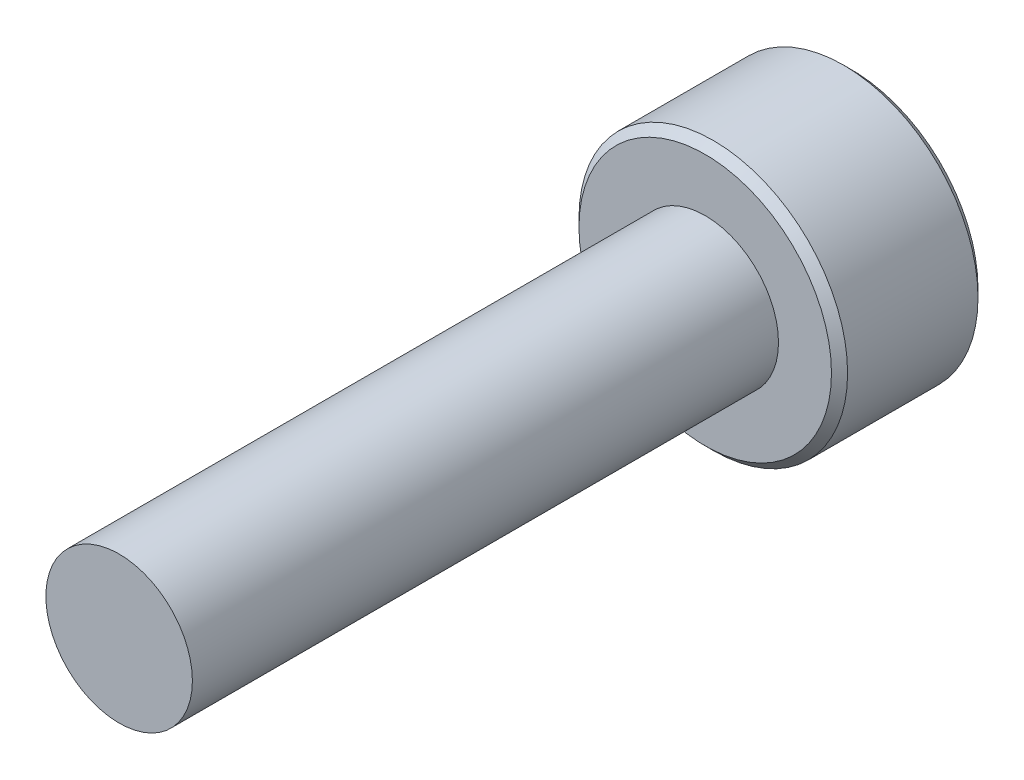
ISO-10303-21;
HEADER;
FILE_DESCRIPTION(('STEP AP214'),'2;1');
FILE_NAME('part.step','',(''),(''),'','','');
FILE_SCHEMA(('AUTOMOTIVE_DESIGN { 1 0 10303 214 1 1 1 1 }'));
ENDSEC;
DATA;
#1=APPLICATION_CONTEXT('core data for automotive mechanical design processes');
#2=APPLICATION_PROTOCOL_DEFINITION('international standard','automotive_design',2000,#1);
#3=PRODUCT_CONTEXT('',#1,'mechanical');
#4=PRODUCT('Part','Part','',(#3));
#5=PRODUCT_RELATED_PRODUCT_CATEGORY('part','',(#4));
#6=PRODUCT_DEFINITION_FORMATION('','',#4);
#7=PRODUCT_DEFINITION_CONTEXT('part definition',#1,'design');
#8=PRODUCT_DEFINITION('design','',#6,#7);
#9=PRODUCT_DEFINITION_SHAPE('','',#8);
#10=(LENGTH_UNIT() NAMED_UNIT(*) SI_UNIT(.MILLI.,.METRE.));
#11=(NAMED_UNIT(*) PLANE_ANGLE_UNIT() SI_UNIT($,.RADIAN.));
#12=(NAMED_UNIT(*) SI_UNIT($,.STERADIAN.) SOLID_ANGLE_UNIT());
#13=UNCERTAINTY_MEASURE_WITH_UNIT(LENGTH_MEASURE(1.E-05),#10,'distance_accuracy_value','');
#14=(GEOMETRIC_REPRESENTATION_CONTEXT(3) GLOBAL_UNCERTAINTY_ASSIGNED_CONTEXT((#13)) GLOBAL_UNIT_ASSIGNED_CONTEXT((#10,
#11,#12)) REPRESENTATION_CONTEXT('',''));
#15=CARTESIAN_POINT('',(0.,0.,0.));
#16=DIRECTION('',(0.,0.,1.));
#17=DIRECTION('',(1.,0.,0.));
#18=AXIS2_PLACEMENT_3D('',#15,#16,#17);
#19=CARTESIAN_POINT('',(0.,0.,-12.));
#20=DIRECTION('',(0.,0.,1.));
#21=DIRECTION('',(1.,0.,0.));
#22=AXIS2_PLACEMENT_3D('',#19,#20,#21);
#23=CYLINDRICAL_SURFACE('',#22,1.5);
#24=CARTESIAN_POINT('',(0.,0.,0.));
#25=DIRECTION('',(0.,0.,1.));
#26=DIRECTION('',(1.,0.,0.));
#27=AXIS2_PLACEMENT_3D('',#24,#25,#26);
#28=CIRCLE('',#27,1.5);
#29=CARTESIAN_POINT('',(1.5,0.,0.));
#30=VERTEX_POINT('',#29);
#31=EDGE_CURVE('E128',#30,#30,#28,.T.);
#32=ORIENTED_EDGE('',*,*,#31,.F.);
#33=EDGE_LOOP('',(#32));
#34=FACE_BOUND('',#33,.T.);
#35=CARTESIAN_POINT('',(0.,0.,-12.));
#36=DIRECTION('',(0.,0.,-1.));
#37=DIRECTION('',(-1.,0.,0.));
#38=AXIS2_PLACEMENT_3D('',#35,#36,#37);
#39=CIRCLE('',#38,1.5);
#40=CARTESIAN_POINT('',(-1.5,0.,-12.));
#41=VERTEX_POINT('',#40);
#42=EDGE_CURVE('E237',#41,#41,#39,.F.);
#43=ORIENTED_EDGE('',*,*,#42,.T.);
#44=EDGE_LOOP('',(#43));
#45=FACE_BOUND('',#44,.T.);
#46=ADVANCED_FACE('F41',(#34,#45),#23,.T.);
#47=CARTESIAN_POINT('',(0.,0.,0.));
#48=DIRECTION('',(0.,0.,1.));
#49=DIRECTION('',(1.,0.,0.));
#50=AXIS2_PLACEMENT_3D('',#47,#48,#49);
#51=PLANE('',#50);
#52=ORIENTED_EDGE('',*,*,#31,.T.);
#53=EDGE_LOOP('',(#52));
#54=FACE_BOUND('',#53,.T.);
#55=ADVANCED_FACE('F222',(#54),#51,.T.);
#56=CARTESIAN_POINT('',(0.,0.,-15.));
#57=DIRECTION('',(0.,0.,1.));
#58=DIRECTION('',(1.,0.,0.));
#59=AXIS2_PLACEMENT_3D('',#56,#57,#58);
#60=CYLINDRICAL_SURFACE('',#59,2.75);
#61=CARTESIAN_POINT('',(0.,0.,-14.835));
#62=DIRECTION('',(0.,0.,-1.));
#63=DIRECTION('',(-1.,0.,0.));
#64=AXIS2_PLACEMENT_3D('',#61,#62,#63);
#65=CIRCLE('',#64,2.75);
#66=CARTESIAN_POINT('',(-2.75,0.,-14.835));
#67=VERTEX_POINT('',#66);
#68=EDGE_CURVE('E50',#67,#67,#65,.F.);
#69=ORIENTED_EDGE('',*,*,#68,.T.);
#70=EDGE_LOOP('',(#69));
#71=FACE_BOUND('',#70,.T.);
#72=CARTESIAN_POINT('',(0.,0.,-12.165));
#73=DIRECTION('',(0.,0.,-1.));
#74=DIRECTION('',(-1.,0.,0.));
#75=AXIS2_PLACEMENT_3D('',#72,#73,#74);
#76=CIRCLE('',#75,2.75);
#77=CARTESIAN_POINT('',(-2.75,0.,-12.165));
#78=VERTEX_POINT('',#77);
#79=EDGE_CURVE('E198',#78,#78,#76,.T.);
#80=ORIENTED_EDGE('',*,*,#79,.T.);
#81=EDGE_LOOP('',(#80));
#82=FACE_BOUND('',#81,.T.);
#83=ADVANCED_FACE('F206',(#71,#82),#60,.T.);
#84=CARTESIAN_POINT('',(0.,0.,-15.));
#85=DIRECTION('',(0.,0.,-1.));
#86=DIRECTION('',(-1.,0.,0.));
#87=AXIS2_PLACEMENT_3D('',#84,#85,#86);
#88=PLANE('',#87);
#89=CARTESIAN_POINT('',(0.,0.,-15.));
#90=DIRECTION('',(0.,0.,-1.));
#91=DIRECTION('',(-1.,0.,0.));
#92=AXIS2_PLACEMENT_3D('',#89,#90,#91);
#93=CIRCLE('',#92,2.585);
#94=CARTESIAN_POINT('',(-2.585,0.,-15.));
#95=VERTEX_POINT('',#94);
#96=EDGE_CURVE('E127',#95,#95,#93,.T.);
#97=ORIENTED_EDGE('',*,*,#96,.T.);
#98=EDGE_LOOP('',(#97));
#99=FACE_BOUND('',#98,.T.);
#100=CARTESIAN_POINT('',(0.,0.,-15.));
#101=DIRECTION('',(0.,0.,-1.));
#102=DIRECTION('',(-1.,0.,0.));
#103=AXIS2_PLACEMENT_3D('',#100,#101,#102);
#104=CIRCLE('',#103,1.44337567297406);
#105=CARTESIAN_POINT('',(-1.25,0.721687836487034,-15.));
#106=VERTEX_POINT('',#105);
#107=CARTESIAN_POINT('',(0.,1.44337567297406,-15.));
#108=VERTEX_POINT('',#107);
#109=EDGE_CURVE('E106',#106,#108,#104,.T.);
#110=ORIENTED_EDGE('',*,*,#109,.F.);
#111=CARTESIAN_POINT('',(-1.25,-0.721687836487033,-15.));
#112=VERTEX_POINT('',#111);
#113=EDGE_CURVE('E58',#112,#106,#104,.T.);
#114=ORIENTED_EDGE('',*,*,#113,.F.);
#115=CARTESIAN_POINT('',(0.,-1.44337567297406,-15.));
#116=VERTEX_POINT('',#115);
#117=EDGE_CURVE('E308',#116,#112,#104,.T.);
#118=ORIENTED_EDGE('',*,*,#117,.F.);
#119=CARTESIAN_POINT('',(1.25,-0.721687836487034,-15.));
#120=VERTEX_POINT('',#119);
#121=EDGE_CURVE('E68',#120,#116,#104,.T.);
#122=ORIENTED_EDGE('',*,*,#121,.F.);
#123=CARTESIAN_POINT('',(1.25,0.721687836487033,-15.));
#124=VERTEX_POINT('',#123);
#125=EDGE_CURVE('E151',#124,#120,#104,.T.);
#126=ORIENTED_EDGE('',*,*,#125,.F.);
#127=EDGE_CURVE('E116',#108,#124,#104,.T.);
#128=ORIENTED_EDGE('',*,*,#127,.F.);
#129=EDGE_LOOP('',(#110,#114,#118,#122,#126,#128));
#130=FACE_BOUND('',#129,.T.);
#131=ADVANCED_FACE('F150',(#99,#130),#88,.T.);
#132=CARTESIAN_POINT('',(0.,0.,-12.));
#133=DIRECTION('',(0.,0.,-1.));
#134=DIRECTION('',(-1.,0.,0.));
#135=AXIS2_PLACEMENT_3D('',#132,#133,#134);
#136=PLANE('',#135);
#137=CARTESIAN_POINT('',(0.,0.,-12.));
#138=DIRECTION('',(0.,0.,-1.));
#139=DIRECTION('',(-1.,0.,0.));
#140=AXIS2_PLACEMENT_3D('',#137,#138,#139);
#141=CIRCLE('',#140,2.585);
#142=CARTESIAN_POINT('',(-2.585,0.,-12.));
#143=VERTEX_POINT('',#142);
#144=EDGE_CURVE('E11',#143,#143,#141,.F.);
#145=ORIENTED_EDGE('',*,*,#144,.T.);
#146=EDGE_LOOP('',(#145));
#147=FACE_BOUND('',#146,.T.);
#148=ORIENTED_EDGE('',*,*,#42,.F.);
#149=EDGE_LOOP('',(#148));
#150=FACE_BOUND('',#149,.T.);
#151=ADVANCED_FACE('F215',(#147,#150),#136,.F.);
#152=CARTESIAN_POINT('',(0.,0.,-15.));
#153=DIRECTION('',(0.,0.,-1.));
#154=DIRECTION('',(-1.,0.,0.));
#155=AXIS2_PLACEMENT_3D('',#152,#153,#154);
#156=CONICAL_SURFACE('',#155,1.44337567297406,0.78539816339745);
#157=ORIENTED_EDGE('',*,*,#127,.T.);
#158=CARTESIAN_POINT('',(-0.000199999999999753,1.4434911430279,-15.0001154839091));
#159=CARTESIAN_POINT('',(0.042775167071587,1.41867941875065,-14.9753216680551));
#160=CARTESIAN_POINT('',(0.0864690047459486,1.39345276980743,-14.9519837344187));
#161=CARTESIAN_POINT('',(0.175565930841943,1.34201263554194,-14.9092520040845));
#162=CARTESIAN_POINT('',(0.220977498357065,1.31579425481276,-14.8898819923604));
#163=CARTESIAN_POINT('',(0.312547820935261,1.26292610442246,-14.8567004834135));
#164=CARTESIAN_POINT('',(0.358683240175886,1.23628980770471,-14.8428055590527));
#165=CARTESIAN_POINT('',(0.451970080407593,1.18243062538508,-14.8213972821606));
#166=CARTESIAN_POINT('',(0.499118649136381,1.15520938653761,-14.8138679415668));
#167=CARTESIAN_POINT('',(0.580373556887254,1.10829684367467,-14.8070744980507));
#168=CARTESIAN_POINT('',(0.614374876627942,1.08866617256958,-14.8060685591043));
#169=CARTESIAN_POINT('',(0.682317764432479,1.04943932800611,-14.8077614149113));
#170=CARTESIAN_POINT('',(0.716259317655659,1.02984316311599,-14.8104610272155));
#171=CARTESIAN_POINT('',(0.783814856457501,0.990839954603499,-14.8194089303164));
#172=CARTESIAN_POINT('',(0.817428507286776,0.971433104248771,-14.8256605258997));
#173=CARTESIAN_POINT('',(0.884094638217814,0.932943395609905,-14.8413756814139));
#174=CARTESIAN_POINT('',(0.917146871030297,0.9138606800983,-14.8508406200875));
#175=CARTESIAN_POINT('',(1.00179969160027,0.864986351354567,-14.8789313906876));
#176=CARTESIAN_POINT('',(1.05286649242964,0.835502920149076,-14.8996701574522));
#177=CARTESIAN_POINT('',(1.15300085411325,0.777690319475909,-14.9463871346715));
#178=CARTESIAN_POINT('',(1.20207431157827,0.749357745598417,-14.9723482959468));
#179=CARTESIAN_POINT('',(1.2502,0.721572366433195,-15.0001154839091));
#180=B_SPLINE_CURVE_WITH_KNOTS('',3,(#158,#159,#160,#161,#162,#163,#164,#165,#166,#167,#168,
#169,#170,#171,#172,#173,#174,#175,#176,#177,#178,#179),.UNSPECIFIED.,.F.,.F.,(4,2,2,2,2,2,2,2,
2,2,4),(0.,0.166533409618304,0.334037607289762,0.498880396489699,0.663307919240275,
0.780963963458828,0.898645970148454,1.01643764860773,1.1342799317155,1.32148652032141,
1.50809158792573),.UNSPECIFIED.);
#181=EDGE_CURVE('E121',#108,#124,#180,.T.);
#182=ORIENTED_EDGE('',*,*,#181,.F.);
#183=EDGE_LOOP('',(#157,#182));
#184=FACE_BOUND('',#183,.T.);
#185=ADVANCED_FACE('F122',(#184),#156,.F.);
#186=ORIENTED_EDGE('',*,*,#125,.T.);
#187=CARTESIAN_POINT('',(1.25,-1.43934010808077,-15.4629820968923));
#188=CARTESIAN_POINT('',(1.25,-1.40429313005659,-15.4365249226329));
#189=CARTESIAN_POINT('',(1.25,-1.36905087135599,-15.4103271603543));
#190=CARTESIAN_POINT('',(1.25,-1.29809650706311,-15.3585575718396));
#191=CARTESIAN_POINT('',(1.25,-1.26238428576495,-15.3329859043563));
#192=CARTESIAN_POINT('',(1.25,-1.15390111792708,-15.2570059936895));
#193=CARTESIAN_POINT('',(1.25,-1.08031646726264,-15.2077402861896));
#194=CARTESIAN_POINT('',(1.25,-0.926012322755096,-15.1110258302631));
#195=CARTESIAN_POINT('',(1.25,-0.845125318656147,-15.0638412989418));
#196=CARTESIAN_POINT('',(1.25,-0.679311174076603,-14.9775307343904));
#197=CARTESIAN_POINT('',(1.25,-0.594398891026688,-14.9383775346269));
#198=CARTESIAN_POINT('',(1.25,-0.466944812460741,-14.8904772236883));
#199=CARTESIAN_POINT('',(1.25,-0.426289985812822,-14.8767294897863));
#200=CARTESIAN_POINT('',(1.25,-0.343998850091268,-14.8524979274505));
#201=CARTESIAN_POINT('',(1.25,-0.302362473614963,-14.8420143238698));
#202=CARTESIAN_POINT('',(1.25,-0.219052696285666,-14.8250301617483));
#203=CARTESIAN_POINT('',(1.25,-0.1773934284745,-14.8184613604714));
#204=CARTESIAN_POINT('',(1.25,-0.0936293693401927,-14.8094350534578));
#205=CARTESIAN_POINT('',(1.25,-0.0515246558543965,-14.8069768409973));
#206=CARTESIAN_POINT('',(1.25,0.0311890576306312,-14.8063540620133));
#207=CARTESIAN_POINT('',(1.25,0.07179696254993,-14.8080371168462));
#208=CARTESIAN_POINT('',(1.25,0.152668636885197,-14.8152682705979));
#209=CARTESIAN_POINT('',(1.25,0.192932338835358,-14.8208171104131));
#210=CARTESIAN_POINT('',(1.25,0.273499879165295,-14.835571036465));
#211=CARTESIAN_POINT('',(1.25,0.313792180618511,-14.8448381759641));
#212=CARTESIAN_POINT('',(1.25,0.393496413911457,-14.8665361784573));
#213=CARTESIAN_POINT('',(1.25,0.432908419115059,-14.8789667767306));
#214=CARTESIAN_POINT('',(1.25,0.556992735862298,-14.9227793529314));
#215=CARTESIAN_POINT('',(1.25,0.639898924666084,-14.959151072876));
#216=CARTESIAN_POINT('',(1.25,0.8018165554997,-15.0400191621783));
#217=CARTESIAN_POINT('',(1.25,0.880812666325043,-15.084544720912));
#218=CARTESIAN_POINT('',(1.25,1.0317856127975,-15.1764048766666));
#219=CARTESIAN_POINT('',(1.25,1.10391618485086,-15.2234899339162));
#220=CARTESIAN_POINT('',(1.25,1.2101860604331,-15.2962785615985));
#221=CARTESIAN_POINT('',(1.25,1.24515069969379,-15.3207980853934));
#222=CARTESIAN_POINT('',(1.25,1.31460220852736,-15.3704856367657));
#223=CARTESIAN_POINT('',(1.25,1.34908920596618,-15.3956534854155));
#224=CARTESIAN_POINT('',(1.25,1.38337731682911,-15.4210901488412));
#225=B_SPLINE_CURVE_WITH_KNOTS('',3,(#187,#188,#189,#190,#191,#192,#193,#194,#195,#196,#197,
#198,#199,#200,#201,#202,#203,#204,#205,#206,#207,#208,#209,#210,#211,#212,#213,#214,#215,#216,
#217,#218,#219,#220,#221,#222,#223,#224),.UNSPECIFIED.,.F.,.F.,(4,2,2,2,2,2,2,2,2,2,2,2,2,2,2,2,
2,2,4),(0.,0.131732960381448,0.263498984161645,0.529042014455826,0.809741926134619,
1.08947609717225,1.21811634272577,1.346765447839,1.47310084517844,1.59941451973785,
1.72115042167849,1.84290966131735,1.96679153905342,2.09066305366039,2.36146692896009,
2.63325989198491,2.89154668212279,3.01965734507713,3.14773302245628),.UNSPECIFIED.);
#226=EDGE_CURVE('E115',#124,#120,#225,.F.);
#227=ORIENTED_EDGE('',*,*,#226,.F.);
#228=EDGE_LOOP('',(#186,#227));
#229=FACE_BOUND('',#228,.T.);
#230=ADVANCED_FACE('F317',(#229),#156,.F.);
#231=ORIENTED_EDGE('',*,*,#121,.T.);
#232=CARTESIAN_POINT('',(1.2502,-0.721572366433195,-15.0001154839091));
#233=CARTESIAN_POINT('',(1.20722483292841,-0.746384090710445,-14.9753216680551));
#234=CARTESIAN_POINT('',(1.16353099525405,-0.771610739653665,-14.9519837344187));
#235=CARTESIAN_POINT('',(1.07443406915806,-0.823050873919156,-14.9092520040845));
#236=CARTESIAN_POINT('',(1.02902250164293,-0.849269254648334,-14.8898819923604));
#237=CARTESIAN_POINT('',(0.937452179064739,-0.902137405038636,-14.8567004834135));
#238=CARTESIAN_POINT('',(0.891316759824113,-0.928773701756388,-14.8428055590527));
#239=CARTESIAN_POINT('',(0.798029919592406,-0.982632884076013,-14.8213972821606));
#240=CARTESIAN_POINT('',(0.750881350863619,-1.00985412292348,-14.8138679415668));
#241=CARTESIAN_POINT('',(0.669626443112746,-1.05676666578643,-14.8070744980507));
#242=CARTESIAN_POINT('',(0.635625123372057,-1.07639733689152,-14.8060685591043));
#243=CARTESIAN_POINT('',(0.567682235567521,-1.11562418145499,-14.8077614149113));
#244=CARTESIAN_POINT('',(0.533740682344341,-1.1352203463451,-14.8104610272155));
#245=CARTESIAN_POINT('',(0.466185143542499,-1.1742235548576,-14.8194089303164));
#246=CARTESIAN_POINT('',(0.432571492713224,-1.19363040521233,-14.8256605258997));
#247=CARTESIAN_POINT('',(0.365905361782185,-1.23212011385119,-14.8413756814139));
#248=CARTESIAN_POINT('',(0.332853128969703,-1.2512028293628,-14.8508406200875));
#249=CARTESIAN_POINT('',(0.248200308399734,-1.30007715810653,-14.8789313906876));
#250=CARTESIAN_POINT('',(0.197133507570361,-1.32956058931202,-14.8996701574522));
#251=CARTESIAN_POINT('',(0.0969991458867449,-1.38737318998519,-14.9463871346715));
#252=CARTESIAN_POINT('',(0.0479256884217306,-1.41570576386268,-14.9723482959468));
#253=CARTESIAN_POINT('',(-0.000200000000000048,-1.4434911430279,-15.0001154839091));
#254=B_SPLINE_CURVE_WITH_KNOTS('',3,(#232,#233,#234,#235,#236,#237,#238,#239,#240,#241,#242,
#243,#244,#245,#246,#247,#248,#249,#250,#251,#252,#253),.UNSPECIFIED.,.F.,.F.,(4,2,2,2,2,2,2,2,
2,2,4),(0.,0.166533409618305,0.334037607289762,0.498880396489699,0.663307919240275,
0.780963963458827,0.898645970148454,1.01643764860773,1.1342799317155,1.32148652032141,
1.50809158792573),.UNSPECIFIED.);
#255=EDGE_CURVE('E165',#120,#116,#254,.T.);
#256=ORIENTED_EDGE('',*,*,#255,.F.);
#257=EDGE_LOOP('',(#231,#256));
#258=FACE_BOUND('',#257,.T.);
#259=ADVANCED_FACE('F314',(#258),#156,.F.);
#260=ORIENTED_EDGE('',*,*,#117,.T.);
#261=CARTESIAN_POINT('',(0.000199999999999485,-1.4434911430279,-15.0001154839091));
#262=CARTESIAN_POINT('',(-0.0427751670715873,-1.41867941875065,-14.9753216680551));
#263=CARTESIAN_POINT('',(-0.0864690047459488,-1.39345276980743,-14.9519837344187));
#264=CARTESIAN_POINT('',(-0.175565930841943,-1.34201263554194,-14.9092520040845));
#265=CARTESIAN_POINT('',(-0.220977498357065,-1.31579425481276,-14.8898819923604));
#266=CARTESIAN_POINT('',(-0.31254782093526,-1.26292610442246,-14.8567004834135));
#267=CARTESIAN_POINT('',(-0.358683240175886,-1.23628980770471,-14.8428055590527));
#268=CARTESIAN_POINT('',(-0.451970080407593,-1.18243062538508,-14.8213972821606));
#269=CARTESIAN_POINT('',(-0.49911864913638,-1.15520938653761,-14.8138679415668));
#270=CARTESIAN_POINT('',(-0.580373556887252,-1.10829684367467,-14.8070744980507));
#271=CARTESIAN_POINT('',(-0.614374876627941,-1.08866617256958,-14.8060685591043));
#272=CARTESIAN_POINT('',(-0.682317764432477,-1.04943932800611,-14.8077614149113));
#273=CARTESIAN_POINT('',(-0.716259317655657,-1.02984316311599,-14.8104610272155));
#274=CARTESIAN_POINT('',(-0.783814856457499,-0.9908399546035,-14.8194089303164));
#275=CARTESIAN_POINT('',(-0.817428507286775,-0.971433104248772,-14.8256605258997));
#276=CARTESIAN_POINT('',(-0.884094638217813,-0.932943395609906,-14.8413756814139));
#277=CARTESIAN_POINT('',(-0.917146871030296,-0.913860680098301,-14.8508406200875));
#278=CARTESIAN_POINT('',(-1.00179969160026,-0.864986351354568,-14.8789313906876));
#279=CARTESIAN_POINT('',(-1.05286649242964,-0.835502920149077,-14.8996701574522));
#280=CARTESIAN_POINT('',(-1.15300085411325,-0.777690319475909,-14.9463871346715));
#281=CARTESIAN_POINT('',(-1.20207431157827,-0.749357745598418,-14.9723482959468));
#282=CARTESIAN_POINT('',(-1.2502,-0.721572366433195,-15.0001154839091));
#283=B_SPLINE_CURVE_WITH_KNOTS('',3,(#261,#262,#263,#264,#265,#266,#267,#268,#269,#270,#271,
#272,#273,#274,#275,#276,#277,#278,#279,#280,#281,#282),.UNSPECIFIED.,.F.,.F.,(4,2,2,2,2,2,2,2,
2,2,4),(0.,0.166533409618304,0.334037607289762,0.498880396489698,0.663307919240274,
0.780963963458826,0.898645970148452,1.01643764860773,1.13427993171549,1.32148652032141,
1.50809158792573),.UNSPECIFIED.);
#284=EDGE_CURVE('E285',#116,#112,#283,.T.);
#285=ORIENTED_EDGE('',*,*,#284,.F.);
#286=EDGE_LOOP('',(#260,#285));
#287=FACE_BOUND('',#286,.T.);
#288=ADVANCED_FACE('F323',(#287),#156,.F.);
#289=ORIENTED_EDGE('',*,*,#113,.T.);
#290=CARTESIAN_POINT('',(-1.25,-1.43934010829019,-15.4629820970504));
#291=CARTESIAN_POINT('',(-1.25,-1.40429313026013,-15.4365249227849));
#292=CARTESIAN_POINT('',(-1.25,-1.36905087155364,-15.4103271605002));
#293=CARTESIAN_POINT('',(-1.25,-1.29809650724891,-15.3585575719734));
#294=CARTESIAN_POINT('',(-1.25,-1.2623842859448,-15.3329859044841));
#295=CARTESIAN_POINT('',(-1.25,-1.1539011180887,-15.257005993799));
#296=CARTESIAN_POINT('',(-1.25,-1.08031646741188,-15.207740286287));
#297=CARTESIAN_POINT('',(-1.25,-0.926012322877304,-15.1110258303356));
#298=CARTESIAN_POINT('',(-1.25,-0.84512531876365,-15.0638412990016));
#299=CARTESIAN_POINT('',(-1.25,-0.679311174153445,-14.9775307344266));
#300=CARTESIAN_POINT('',(-1.25,-0.594398891087584,-14.9383775346522));
#301=CARTESIAN_POINT('',(-1.25,-0.466944812509639,-14.8904772237056));
#302=CARTESIAN_POINT('',(-1.25,-0.426289985866745,-14.8767294898039));
#303=CARTESIAN_POINT('',(-1.25,-0.343998850155403,-14.8524979274677));
#304=CARTESIAN_POINT('',(-1.25,-0.302362473684286,-14.8420143238863));
#305=CARTESIAN_POINT('',(-1.25,-0.219052696365195,-14.8250301617622));
#306=CARTESIAN_POINT('',(-1.25,-0.177393428559044,-14.8184613604834));
#307=CARTESIAN_POINT('',(-1.25,-0.0936293694345982,-14.809435053465));
#308=CARTESIAN_POINT('',(-1.25,-0.0515246559536491,-14.8069768410015));
#309=CARTESIAN_POINT('',(-1.25,0.0311890575224384,-14.8063540620107));
#310=CARTESIAN_POINT('',(-1.25,0.0717969624376316,-14.8080371168399));
#311=CARTESIAN_POINT('',(-1.25,0.152668636765092,-14.8152682705835));
#312=CARTESIAN_POINT('',(-1.25,0.192932338711553,-14.8208171103943));
#313=CARTESIAN_POINT('',(-1.25,0.273499879034189,-14.835571036437));
#314=CARTESIAN_POINT('',(-1.25,0.313792180483814,-14.8448381759314));
#315=CARTESIAN_POINT('',(-1.25,0.393496413769925,-14.8665361784149));
#316=CARTESIAN_POINT('',(-1.25,0.432908418970283,-14.8789667766833));
#317=CARTESIAN_POINT('',(-1.25,0.556992735685997,-14.9227793528609));
#318=CARTESIAN_POINT('',(-1.25,0.639898924463084,-14.9591510727842));
#319=CARTESIAN_POINT('',(-1.25,0.801816555245349,-15.0400191620416));
#320=CARTESIAN_POINT('',(-1.25,0.880812666046053,-15.0845447207516));
#321=CARTESIAN_POINT('',(-1.25,1.03178561247421,-15.176404876461));
#322=CARTESIAN_POINT('',(-1.25,1.10391618450775,-15.2234899336892));
#323=CARTESIAN_POINT('',(-1.25,1.2101860600607,-15.2962785613395));
#324=CARTESIAN_POINT('',(-1.25,1.24515069931176,-15.3207980851238));
#325=CARTESIAN_POINT('',(-1.25,1.31460220812614,-15.3704856364749));
#326=CARTESIAN_POINT('',(-1.25,1.34908920555539,-15.3956534851142));
#327=CARTESIAN_POINT('',(-1.25,1.38337731640878,-15.4210901485293));
#328=B_SPLINE_CURVE_WITH_KNOTS('',3,(#290,#291,#292,#293,#294,#295,#296,#297,#298,#299,#300,
#301,#302,#303,#304,#305,#306,#307,#308,#309,#310,#311,#312,#313,#314,#315,#316,#317,#318,#319,
#320,#321,#322,#323,#324,#325,#326,#327),.UNSPECIFIED.,.F.,.F.,(4,2,2,2,2,2,2,2,2,2,2,2,2,2,2,2,
2,2,4),(0.,0.131732960406522,0.263498984211801,0.529042014557081,0.809741926293179,
1.08947609738757,1.21811634292656,1.3467654480253,1.47310084535082,1.59941451989631,
1.72115042182424,1.84290966145034,1.96679153917269,2.09066305376595,2.36146692896708,
2.63325989189267,2.89154668194565,3.01965734485811,3.1477330221954),.UNSPECIFIED.);
#329=EDGE_CURVE('E139',#112,#106,#328,.T.);
#330=ORIENTED_EDGE('',*,*,#329,.F.);
#331=EDGE_LOOP('',(#289,#330));
#332=FACE_BOUND('',#331,.T.);
#333=ADVANCED_FACE('F327',(#332),#156,.F.);
#334=ORIENTED_EDGE('',*,*,#109,.T.);
#335=CARTESIAN_POINT('',(-1.2502,0.721572366433195,-15.0001154839091));
#336=CARTESIAN_POINT('',(-1.20722483292841,0.746384090710445,-14.9753216680551));
#337=CARTESIAN_POINT('',(-1.16353099525405,0.771610739653666,-14.9519837344187));
#338=CARTESIAN_POINT('',(-1.07443406915806,0.823050873919156,-14.9092520040845));
#339=CARTESIAN_POINT('',(-1.02902250164293,0.849269254648335,-14.8898819923604));
#340=CARTESIAN_POINT('',(-0.937452179064738,0.902137405038637,-14.8567004834135));
#341=CARTESIAN_POINT('',(-0.891316759824113,0.928773701756388,-14.8428055590527));
#342=CARTESIAN_POINT('',(-0.798029919592406,0.982632884076014,-14.8213972821606));
#343=CARTESIAN_POINT('',(-0.750881350863619,1.00985412292348,-14.8138679415668));
#344=CARTESIAN_POINT('',(-0.669626443112746,1.05676666578643,-14.8070744980507));
#345=CARTESIAN_POINT('',(-0.635625123372058,1.07639733689152,-14.8060685591043));
#346=CARTESIAN_POINT('',(-0.567682235567521,1.11562418145499,-14.8077614149113));
#347=CARTESIAN_POINT('',(-0.533740682344341,1.1352203463451,-14.8104610272155));
#348=CARTESIAN_POINT('',(-0.466185143542499,1.1742235548576,-14.8194089303164));
#349=CARTESIAN_POINT('',(-0.432571492713224,1.19363040521233,-14.8256605258997));
#350=CARTESIAN_POINT('',(-0.365905361782186,1.23212011385119,-14.8413756814139));
#351=CARTESIAN_POINT('',(-0.332853128969703,1.2512028293628,-14.8508406200875));
#352=CARTESIAN_POINT('',(-0.248200308399735,1.30007715810653,-14.8789313906876));
#353=CARTESIAN_POINT('',(-0.197133507570361,1.32956058931202,-14.8996701574522));
#354=CARTESIAN_POINT('',(-0.0969991458867449,1.38737318998519,-14.9463871346715));
#355=CARTESIAN_POINT('',(-0.0479256884217303,1.41570576386268,-14.9723482959468));
#356=CARTESIAN_POINT('',(0.000199999999999714,1.4434911430279,-15.0001154839091));
#357=B_SPLINE_CURVE_WITH_KNOTS('',3,(#335,#336,#337,#338,#339,#340,#341,#342,#343,#344,#345,
#346,#347,#348,#349,#350,#351,#352,#353,#354,#355,#356),.UNSPECIFIED.,.F.,.F.,(4,2,2,2,2,2,2,2,
2,2,4),(0.,0.166533409618305,0.334037607289763,0.498880396489699,0.663307919240275,
0.780963963458827,0.898645970148453,1.01643764860773,1.1342799317155,1.32148652032141,
1.50809158792573),.UNSPECIFIED.);
#358=EDGE_CURVE('E110',#106,#108,#357,.T.);
#359=ORIENTED_EDGE('',*,*,#358,.F.);
#360=EDGE_LOOP('',(#334,#359));
#361=FACE_BOUND('',#360,.T.);
#362=ADVANCED_FACE('F108',(#361),#156,.F.);
#363=CARTESIAN_POINT('',(1.25,2.1650635094611,-13.125));
#364=DIRECTION('',(0.,0.,-1.));
#365=DIRECTION('',(-1.,0.,0.));
#366=AXIS2_PLACEMENT_3D('',#363,#364,#365);
#367=PLANE('',#366);
#368=DIRECTION('',(0.866025403784439,0.5,0.));
#369=VECTOR('',#368,1.);
#370=CARTESIAN_POINT('',(-1.25,0.721687836487033,-13.125));
#371=LINE('',#370,#369);
#372=CARTESIAN_POINT('',(-1.25,0.721687836487033,-13.125));
#373=VERTEX_POINT('',#372);
#374=CARTESIAN_POINT('',(0.,1.44337567297406,-13.125));
#375=VERTEX_POINT('',#374);
#376=EDGE_CURVE('E138',#373,#375,#371,.T.);
#377=ORIENTED_EDGE('',*,*,#376,.T.);
#378=DIRECTION('',(0.866025403784439,-0.5,0.));
#379=VECTOR('',#378,1.);
#380=CARTESIAN_POINT('',(0.,1.44337567297406,-13.125));
#381=LINE('',#380,#379);
#382=CARTESIAN_POINT('',(1.25,0.721687836487033,-13.125));
#383=VERTEX_POINT('',#382);
#384=EDGE_CURVE('E143',#375,#383,#381,.T.);
#385=ORIENTED_EDGE('',*,*,#384,.T.);
#386=DIRECTION('',(0.,-1.,0.));
#387=VECTOR('',#386,1.);
#388=CARTESIAN_POINT('',(1.25,0.721687836487033,-13.125));
#389=LINE('',#388,#387);
#390=CARTESIAN_POINT('',(1.25,-0.721687836487033,-13.125));
#391=VERTEX_POINT('',#390);
#392=EDGE_CURVE('E267',#383,#391,#389,.T.);
#393=ORIENTED_EDGE('',*,*,#392,.T.);
#394=DIRECTION('',(-0.866025403784439,-0.5,0.));
#395=VECTOR('',#394,1.);
#396=CARTESIAN_POINT('',(1.25,-0.721687836487033,-13.125));
#397=LINE('',#396,#395);
#398=CARTESIAN_POINT('',(0.,-1.44337567297406,-13.125));
#399=VERTEX_POINT('',#398);
#400=EDGE_CURVE('E264',#391,#399,#397,.T.);
#401=ORIENTED_EDGE('',*,*,#400,.T.);
#402=DIRECTION('',(-0.866025403784439,0.5,0.));
#403=VECTOR('',#402,1.);
#404=CARTESIAN_POINT('',(0.,-1.44337567297406,-13.125));
#405=LINE('',#404,#403);
#406=CARTESIAN_POINT('',(-1.25,-0.721687836487033,-13.125));
#407=VERTEX_POINT('',#406);
#408=EDGE_CURVE('E260',#399,#407,#405,.T.);
#409=ORIENTED_EDGE('',*,*,#408,.T.);
#410=DIRECTION('',(0.,1.,0.));
#411=VECTOR('',#410,1.);
#412=CARTESIAN_POINT('',(-1.25,-0.721687836487033,-13.125));
#413=LINE('',#412,#411);
#414=EDGE_CURVE('E147',#407,#373,#413,.T.);
#415=ORIENTED_EDGE('',*,*,#414,.T.);
#416=EDGE_LOOP('',(#377,#385,#393,#401,#409,#415));
#417=FACE_BOUND('',#416,.T.);
#418=ADVANCED_FACE('F185',(#417),#367,.T.);
#419=CARTESIAN_POINT('',(0.,1.44337567297406,-13.125));
#420=DIRECTION('',(0.5,0.866025403784439,0.));
#421=DIRECTION('',(-0.866025403784439,0.5,0.));
#422=AXIS2_PLACEMENT_3D('',#419,#420,#421);
#423=PLANE('',#422);
#424=DIRECTION('',(0.,0.,-1.));
#425=VECTOR('',#424,1.);
#426=CARTESIAN_POINT('',(0.,1.44337567297406,-13.125));
#427=LINE('',#426,#425);
#428=EDGE_CURVE('E134',#375,#108,#427,.T.);
#429=ORIENTED_EDGE('',*,*,#428,.T.);
#430=ORIENTED_EDGE('',*,*,#181,.T.);
#431=DIRECTION('',(0.,0.,-1.));
#432=VECTOR('',#431,1.);
#433=CARTESIAN_POINT('',(1.25,0.721687836487033,-13.125));
#434=LINE('',#433,#432);
#435=EDGE_CURVE('E146',#383,#124,#434,.T.);
#436=ORIENTED_EDGE('',*,*,#435,.F.);
#437=ORIENTED_EDGE('',*,*,#384,.F.);
#438=EDGE_LOOP('',(#429,#430,#436,#437));
#439=FACE_BOUND('',#438,.T.);
#440=ADVANCED_FACE('F141',(#439),#423,.F.);
#441=CARTESIAN_POINT('',(1.25,0.721687836487033,-13.125));
#442=DIRECTION('',(1.,0.,0.));
#443=DIRECTION('',(0.,0.,-1.));
#444=AXIS2_PLACEMENT_3D('',#441,#442,#443);
#445=PLANE('',#444);
#446=ORIENTED_EDGE('',*,*,#435,.T.);
#447=ORIENTED_EDGE('',*,*,#226,.T.);
#448=DIRECTION('',(0.,0.,-1.));
#449=VECTOR('',#448,1.);
#450=CARTESIAN_POINT('',(1.25,-0.721687836487033,-13.125));
#451=LINE('',#450,#449);
#452=EDGE_CURVE('E247',#391,#120,#451,.T.);
#453=ORIENTED_EDGE('',*,*,#452,.F.);
#454=ORIENTED_EDGE('',*,*,#392,.F.);
#455=EDGE_LOOP('',(#446,#447,#453,#454));
#456=FACE_BOUND('',#455,.T.);
#457=ADVANCED_FACE('F174',(#456),#445,.F.);
#458=CARTESIAN_POINT('',(1.25,-0.721687836487033,-13.125));
#459=DIRECTION('',(0.5,-0.866025403784439,0.));
#460=DIRECTION('',(0.866025403784439,0.5,0.));
#461=AXIS2_PLACEMENT_3D('',#458,#459,#460);
#462=PLANE('',#461);
#463=ORIENTED_EDGE('',*,*,#452,.T.);
#464=ORIENTED_EDGE('',*,*,#255,.T.);
#465=DIRECTION('',(0.,0.,-1.));
#466=VECTOR('',#465,1.);
#467=CARTESIAN_POINT('',(0.,-1.44337567297406,-13.125));
#468=LINE('',#467,#466);
#469=EDGE_CURVE('E251',#399,#116,#468,.T.);
#470=ORIENTED_EDGE('',*,*,#469,.F.);
#471=ORIENTED_EDGE('',*,*,#400,.F.);
#472=EDGE_LOOP('',(#463,#464,#470,#471));
#473=FACE_BOUND('',#472,.T.);
#474=ADVANCED_FACE('F178',(#473),#462,.F.);
#475=CARTESIAN_POINT('',(0.,-1.44337567297406,-13.125));
#476=DIRECTION('',(-0.5,-0.866025403784439,0.));
#477=DIRECTION('',(0.866025403784439,-0.5,0.));
#478=AXIS2_PLACEMENT_3D('',#475,#476,#477);
#479=PLANE('',#478);
#480=ORIENTED_EDGE('',*,*,#469,.T.);
#481=ORIENTED_EDGE('',*,*,#284,.T.);
#482=DIRECTION('',(0.,0.,-1.));
#483=VECTOR('',#482,1.);
#484=CARTESIAN_POINT('',(-1.25,-0.721687836487033,-13.125));
#485=LINE('',#484,#483);
#486=EDGE_CURVE('E243',#407,#112,#485,.T.);
#487=ORIENTED_EDGE('',*,*,#486,.F.);
#488=ORIENTED_EDGE('',*,*,#408,.F.);
#489=EDGE_LOOP('',(#480,#481,#487,#488));
#490=FACE_BOUND('',#489,.T.);
#491=ADVANCED_FACE('F293',(#490),#479,.F.);
#492=CARTESIAN_POINT('',(-1.25,-0.721687836487033,-13.125));
#493=DIRECTION('',(-1.,0.,0.));
#494=DIRECTION('',(0.,-1.,0.));
#495=AXIS2_PLACEMENT_3D('',#492,#493,#494);
#496=PLANE('',#495);
#497=ORIENTED_EDGE('',*,*,#486,.T.);
#498=ORIENTED_EDGE('',*,*,#329,.T.);
#499=DIRECTION('',(0.,0.,-1.));
#500=VECTOR('',#499,1.);
#501=CARTESIAN_POINT('',(-1.25,0.721687836487033,-13.125));
#502=LINE('',#501,#500);
#503=EDGE_CURVE('E136',#373,#106,#502,.T.);
#504=ORIENTED_EDGE('',*,*,#503,.F.);
#505=ORIENTED_EDGE('',*,*,#414,.F.);
#506=EDGE_LOOP('',(#497,#498,#504,#505));
#507=FACE_BOUND('',#506,.T.);
#508=ADVANCED_FACE('F290',(#507),#496,.F.);
#509=CARTESIAN_POINT('',(-1.25,0.721687836487033,-13.125));
#510=DIRECTION('',(-0.5,0.866025403784439,0.));
#511=DIRECTION('',(-0.866025403784439,-0.5,0.));
#512=AXIS2_PLACEMENT_3D('',#509,#510,#511);
#513=PLANE('',#512);
#514=ORIENTED_EDGE('',*,*,#503,.T.);
#515=ORIENTED_EDGE('',*,*,#358,.T.);
#516=ORIENTED_EDGE('',*,*,#428,.F.);
#517=ORIENTED_EDGE('',*,*,#376,.F.);
#518=EDGE_LOOP('',(#514,#515,#516,#517));
#519=FACE_BOUND('',#518,.T.);
#520=ADVANCED_FACE('F132',(#519),#513,.F.);
#521=CARTESIAN_POINT('',(0.,0.,-15.));
#522=DIRECTION('',(0.,0.,1.));
#523=DIRECTION('',(1.,0.,0.));
#524=AXIS2_PLACEMENT_3D('',#521,#522,#523);
#525=CONICAL_SURFACE('',#524,2.585,0.78539816339744);
#526=ORIENTED_EDGE('',*,*,#68,.F.);
#527=EDGE_LOOP('',(#526));
#528=FACE_BOUND('',#527,.T.);
#529=ORIENTED_EDGE('',*,*,#96,.F.);
#530=EDGE_LOOP('',(#529));
#531=FACE_BOUND('',#530,.T.);
#532=ADVANCED_FACE('F209',(#528,#531),#525,.T.);
#533=CARTESIAN_POINT('',(0.,0.,-12.165));
#534=DIRECTION('',(0.,0.,-1.));
#535=DIRECTION('',(-1.,0.,0.));
#536=AXIS2_PLACEMENT_3D('',#533,#534,#535);
#537=CONICAL_SURFACE('',#536,2.75,0.785398163397446);
#538=ORIENTED_EDGE('',*,*,#144,.F.);
#539=EDGE_LOOP('',(#538));
#540=FACE_BOUND('',#539,.T.);
#541=ORIENTED_EDGE('',*,*,#79,.F.);
#542=EDGE_LOOP('',(#541));
#543=FACE_BOUND('',#542,.T.);
#544=ADVANCED_FACE('F43',(#540,#543),#537,.T.);
#545=CLOSED_SHELL('',(#46,#55,#83,#131,#151,#185,#230,#259,#288,#333,#362,#418,#440,#457,#474,
#491,#508,#520,#532,#544));
#546=MANIFOLD_SOLID_BREP('B2',#545);
#547=ADVANCED_BREP_SHAPE_REPRESENTATION('',(#18,#546),#14);
#548=SHAPE_DEFINITION_REPRESENTATION(#9,#547);
ENDSEC;
END-ISO-10303-21;
